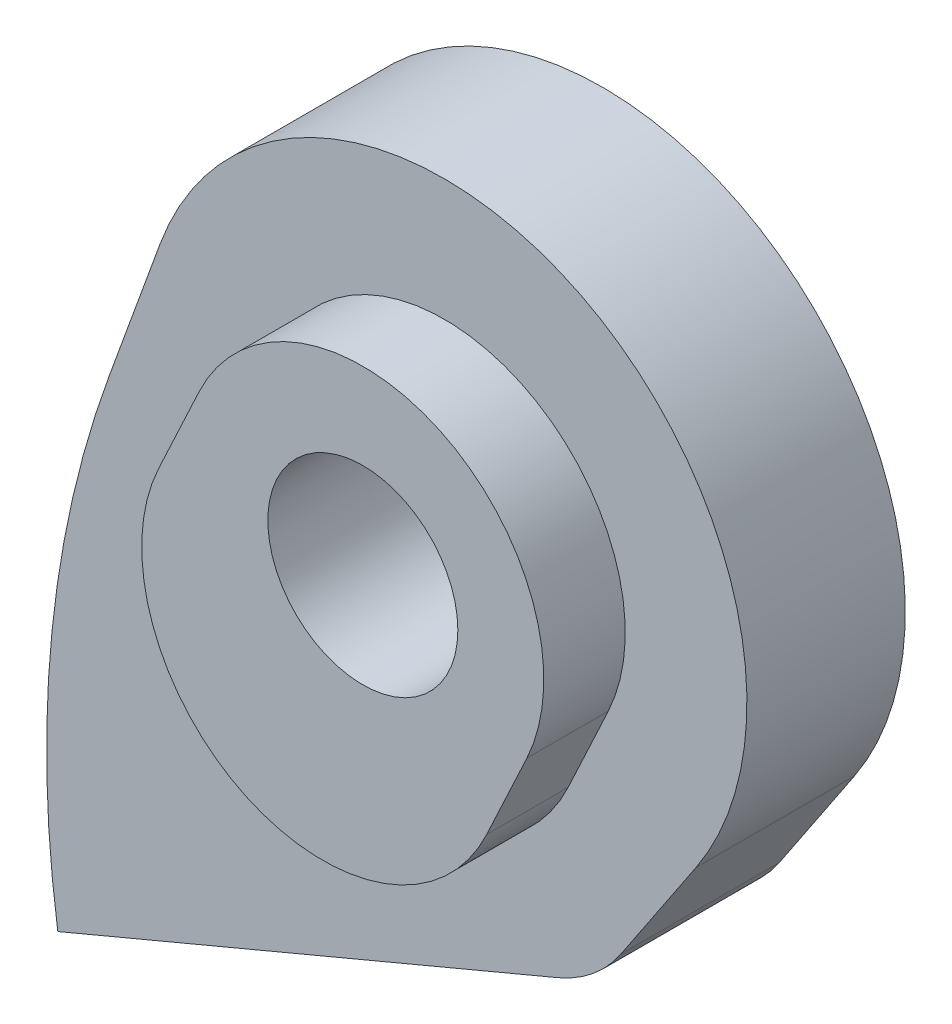
ISO-10303-21;
HEADER;
FILE_DESCRIPTION(('STEP AP214'),'2;1');
FILE_NAME('part.step','',(''),(''),'','','');
FILE_SCHEMA(('AUTOMOTIVE_DESIGN { 1 0 10303 214 1 1 1 1 }'));
ENDSEC;
DATA;
#1=APPLICATION_CONTEXT('core data for automotive mechanical design processes');
#2=APPLICATION_PROTOCOL_DEFINITION('international standard','automotive_design',2000,#1);
#3=PRODUCT_CONTEXT('',#1,'mechanical');
#4=PRODUCT('Part','Part','',(#3));
#5=PRODUCT_RELATED_PRODUCT_CATEGORY('part','',(#4));
#6=PRODUCT_DEFINITION_FORMATION('','',#4);
#7=PRODUCT_DEFINITION_CONTEXT('part definition',#1,'design');
#8=PRODUCT_DEFINITION('design','',#6,#7);
#9=PRODUCT_DEFINITION_SHAPE('','',#8);
#10=(LENGTH_UNIT() NAMED_UNIT(*) SI_UNIT(.MILLI.,.METRE.));
#11=(NAMED_UNIT(*) PLANE_ANGLE_UNIT() SI_UNIT($,.RADIAN.));
#12=(NAMED_UNIT(*) SI_UNIT($,.STERADIAN.) SOLID_ANGLE_UNIT());
#13=UNCERTAINTY_MEASURE_WITH_UNIT(LENGTH_MEASURE(1.E-05),#10,'distance_accuracy_value','');
#14=(GEOMETRIC_REPRESENTATION_CONTEXT(3) GLOBAL_UNCERTAINTY_ASSIGNED_CONTEXT((#13)) GLOBAL_UNIT_ASSIGNED_CONTEXT((#10,
#11,#12)) REPRESENTATION_CONTEXT('',''));
#15=CARTESIAN_POINT('',(0.,0.,0.));
#16=DIRECTION('',(0.,0.,1.));
#17=DIRECTION('',(1.,0.,0.));
#18=AXIS2_PLACEMENT_3D('',#15,#16,#17);
#19=CARTESIAN_POINT('',(0.11468761398859,80.1325343968941,0.));
#20=DIRECTION('',(0.,0.,1.));
#21=DIRECTION('',(1.,0.,0.));
#22=AXIS2_PLACEMENT_3D('',#19,#20,#21);
#23=PLANE('',#22);
#24=CARTESIAN_POINT('',(14.2795120747355,71.4970986035797,0.));
#25=DIRECTION('',(0.,0.,1.));
#26=DIRECTION('',(1.,0.,0.));
#27=AXIS2_PLACEMENT_3D('',#24,#25,#26);
#28=CIRCLE('',#27,22.9540740082007);
#29=CARTESIAN_POINT('',(-7.29026188774433,79.3478542857725,0.));
#30=VERTEX_POINT('',#29);
#31=CARTESIAN_POINT('',(-8.42769677737512,68.1396919078421,0.));
#32=VERTEX_POINT('',#31);
#33=EDGE_CURVE('E154',#30,#32,#28,.T.);
#34=ORIENTED_EDGE('',*,*,#33,.T.);
#35=DIRECTION('',(-0.921960246209325,-0.387284526426812,0.));
#36=VECTOR('',#35,1.);
#37=CARTESIAN_POINT('',(2.62584420432856,72.7829131335289,0.));
#38=LINE('',#37,#36);
#39=CARTESIAN_POINT('',(2.62584420432857,72.7829131335288,0.));
#40=VERTEX_POINT('',#39);
#41=EDGE_CURVE('E178',#40,#32,#38,.T.);
#42=ORIENTED_EDGE('',*,*,#41,.F.);
#43=CARTESIAN_POINT('',(1.41064938117233,75.6757767567832,0.));
#44=DIRECTION('',(0.,0.,-1.));
#45=DIRECTION('',(-1.,0.,0.));
#46=AXIS2_PLACEMENT_3D('',#43,#44,#45);
#47=CIRCLE('',#46,3.13773140994799);
#48=CARTESIAN_POINT('',(4.02035151590427,73.933705240183,0.));
#49=VERTEX_POINT('',#48);
#50=EDGE_CURVE('E173',#49,#40,#47,.T.);
#51=ORIENTED_EDGE('',*,*,#50,.F.);
#52=DIRECTION('',(0.555200968150768,0.831716228628761,0.));
#53=VECTOR('',#52,1.);
#54=CARTESIAN_POINT('',(4.02035151590429,73.933705240183,0.));
#55=LINE('',#54,#53);
#56=CARTESIAN_POINT('',(5.67886918351501,76.4182399199654,0.));
#57=VERTEX_POINT('',#56);
#58=EDGE_CURVE('E147',#49,#57,#55,.T.);
#59=ORIENTED_EDGE('',*,*,#58,.T.);
#60=CARTESIAN_POINT('',(0.11468761398859,80.1325343968941,0.));
#61=DIRECTION('',(0.,0.,1.));
#62=DIRECTION('',(1.,0.,0.));
#63=AXIS2_PLACEMENT_3D('',#60,#61,#62);
#64=CIRCLE('',#63,6.69000000000006);
#65=CARTESIAN_POINT('',(-6.17185601906935,82.4206491557424,0.));
#66=VERTEX_POINT('',#65);
#67=EDGE_CURVE('E149',#57,#66,#64,.T.);
#68=ORIENTED_EDGE('',*,*,#67,.T.);
#69=DIRECTION('',(-0.342020143325666,-0.939692620785909,0.));
#70=VECTOR('',#69,1.);
#71=CARTESIAN_POINT('',(-6.1718560190694,82.4206491557424,0.));
#72=LINE('',#71,#70);
#73=EDGE_CURVE('E155',#66,#30,#72,.T.);
#74=ORIENTED_EDGE('',*,*,#73,.T.);
#75=EDGE_LOOP('',(#34,#42,#51,#59,#68,#74));
#76=FACE_BOUND('',#75,.T.);
#77=DIRECTION('',(-0.4226182617407,-0.90630778703665,0.));
#78=VECTOR('',#77,1.);
#79=CARTESIAN_POINT('',(-3.51054353415801,81.8230074438569,0.));
#80=LINE('',#79,#78);
#81=CARTESIAN_POINT('',(-3.51054353415801,81.8230074438569,0.));
#82=VERTEX_POINT('',#81);
#83=CARTESIAN_POINT('',(-4.39804188381347,79.9197610910799,0.));
#84=VERTEX_POINT('',#83);
#85=EDGE_CURVE('E241',#82,#84,#80,.T.);
#86=ORIENTED_EDGE('',*,*,#85,.F.);
#87=CARTESIAN_POINT('',(0.114687613988609,80.1325343968941,0.));
#88=DIRECTION('',(0.,0.,1.));
#89=DIRECTION('',(1.,0.,0.));
#90=AXIS2_PLACEMENT_3D('',#87,#88,#89);
#91=CIRCLE('',#90,4.00000000000001);
#92=CARTESIAN_POINT('',(3.73991876213519,78.4420613499313,0.));
#93=VERTEX_POINT('',#92);
#94=EDGE_CURVE('E145',#93,#82,#91,.T.);
#95=ORIENTED_EDGE('',*,*,#94,.F.);
#96=DIRECTION('',(0.4226182617407,0.90630778703665,0.));
#97=VECTOR('',#96,1.);
#98=CARTESIAN_POINT('',(3.73991876213519,78.4420613499313,0.));
#99=LINE('',#98,#97);
#100=CARTESIAN_POINT('',(2.85242041247973,76.5388149971543,0.));
#101=VERTEX_POINT('',#100);
#102=EDGE_CURVE('E141',#101,#93,#99,.T.);
#103=ORIENTED_EDGE('',*,*,#102,.F.);
#104=CARTESIAN_POINT('',(-0.772810735666862,78.2292880441171,0.));
#105=DIRECTION('',(0.,0.,1.));
#106=DIRECTION('',(1.,0.,0.));
#107=AXIS2_PLACEMENT_3D('',#104,#105,#106);
#108=CIRCLE('',#107,4.00000000000001);
#109=EDGE_CURVE('E243',#84,#101,#108,.T.);
#110=ORIENTED_EDGE('',*,*,#109,.F.);
#111=EDGE_LOOP('',(#86,#95,#103,#110));
#112=FACE_BOUND('',#111,.T.);
#113=ADVANCED_FACE('F33',(#76,#112),#23,.T.);
#114=CARTESIAN_POINT('',(-8.01359795678153,76.9658058271043,-6.5));
#115=DIRECTION('',(-0.921960246209324,-0.387284526426815,0.));
#116=DIRECTION('',(0.387284526426815,-0.921960246209324,0.));
#117=AXIS2_PLACEMENT_3D('',#114,#115,#116);
#118=PLANE('',#117);
#119=DIRECTION('',(0.387284526426815,-0.921960246209324,0.));
#120=VECTOR('',#119,1.);
#121=CARTESIAN_POINT('',(-8.01359795678153,76.9658058271043,-3.5));
#122=LINE('',#121,#120);
#123=CARTESIAN_POINT('',(-8.01359795678153,76.9658058271043,-3.5));
#124=VERTEX_POINT('',#123);
#125=CARTESIAN_POINT('',(-4.92424784177968,69.611373108264,-3.5));
#126=VERTEX_POINT('',#125);
#127=EDGE_CURVE('E56',#124,#126,#122,.T.);
#128=ORIENTED_EDGE('',*,*,#127,.T.);
#129=DIRECTION('',(0.,0.,1.));
#130=VECTOR('',#129,1.);
#131=CARTESIAN_POINT('',(-4.92424784177968,69.611373108264,-6.5));
#132=LINE('',#131,#130);
#133=CARTESIAN_POINT('',(-4.92424784177968,69.611373108264,-6.5));
#134=VERTEX_POINT('',#133);
#135=EDGE_CURVE('E166',#134,#126,#132,.T.);
#136=ORIENTED_EDGE('',*,*,#135,.F.);
#137=DIRECTION('',(0.387284526426815,-0.921960246209324,0.));
#138=VECTOR('',#137,1.);
#139=CARTESIAN_POINT('',(-8.01359795678153,76.9658058271043,-6.5));
#140=LINE('',#139,#138);
#141=CARTESIAN_POINT('',(-8.01359795678153,76.9658058271043,-6.5));
#142=VERTEX_POINT('',#141);
#143=EDGE_CURVE('E164',#142,#134,#140,.T.);
#144=ORIENTED_EDGE('',*,*,#143,.F.);
#145=DIRECTION('',(0.,0.,1.));
#146=VECTOR('',#145,1.);
#147=CARTESIAN_POINT('',(-8.01359795678153,76.9658058271043,-6.5));
#148=LINE('',#147,#146);
#149=EDGE_CURVE('E170',#142,#124,#148,.T.);
#150=ORIENTED_EDGE('',*,*,#149,.T.);
#151=EDGE_LOOP('',(#128,#136,#144,#150));
#152=FACE_BOUND('',#151,.T.);
#153=ADVANCED_FACE('F230',(#152),#118,.F.);
#154=CARTESIAN_POINT('',(14.2795120747355,71.4970986035797,-6.5));
#155=DIRECTION('',(0.,0.,1.));
#156=DIRECTION('',(1.,0.,0.));
#157=AXIS2_PLACEMENT_3D('',#154,#155,#156);
#158=PLANE('',#157);
#159=DIRECTION('',(-0.921960246209326,-0.38728452642681,0.));
#160=VECTOR('',#159,1.);
#161=CARTESIAN_POINT('',(-4.92424784177968,69.611373108264,-6.5));
#162=LINE('',#161,#160);
#163=CARTESIAN_POINT('',(-8.42769677737511,68.1396919078421,-6.5));
#164=VERTEX_POINT('',#163);
#165=EDGE_CURVE('E159',#134,#164,#162,.T.);
#166=ORIENTED_EDGE('',*,*,#165,.T.);
#167=CARTESIAN_POINT('',(14.2795120747355,71.4970986035797,-6.5));
#168=DIRECTION('',(0.,0.,-1.));
#169=DIRECTION('',(1.,0.,0.));
#170=AXIS2_PLACEMENT_3D('',#167,#168,#169);
#171=CIRCLE('',#170,22.9540740082007);
#172=EDGE_CURVE('E162',#164,#142,#171,.T.);
#173=ORIENTED_EDGE('',*,*,#172,.T.);
#174=ORIENTED_EDGE('',*,*,#143,.T.);
#175=EDGE_LOOP('',(#166,#173,#174));
#176=FACE_BOUND('',#175,.T.);
#177=ADVANCED_FACE('F281',(#176),#158,.F.);
#178=CARTESIAN_POINT('',(0.11468761398859,80.1325343968941,-3.5));
#179=DIRECTION('',(0.,0.,1.));
#180=DIRECTION('',(1.,0.,0.));
#181=AXIS2_PLACEMENT_3D('',#178,#179,#180);
#182=PLANE('',#181);
#183=CARTESIAN_POINT('',(0.11468761398859,80.1325343968941,-3.5));
#184=DIRECTION('',(0.,0.,1.));
#185=DIRECTION('',(1.,0.,0.));
#186=AXIS2_PLACEMENT_3D('',#183,#184,#185);
#187=CIRCLE('',#186,2.10000000000001);
#188=CARTESIAN_POINT('',(2.2146876139886,80.1325343968941,-3.5));
#189=VERTEX_POINT('',#188);
#190=EDGE_CURVE('E246',#189,#189,#187,.T.);
#191=ORIENTED_EDGE('',*,*,#190,.T.);
#192=EDGE_LOOP('',(#191));
#193=FACE_BOUND('',#192,.T.);
#194=ORIENTED_EDGE('',*,*,#127,.F.);
#195=CARTESIAN_POINT('',(14.2795120747355,71.4970986035797,-3.5));
#196=DIRECTION('',(0.,0.,-1.));
#197=DIRECTION('',(-1.,0.,0.));
#198=AXIS2_PLACEMENT_3D('',#195,#196,#197);
#199=CIRCLE('',#198,22.9540740082007);
#200=CARTESIAN_POINT('',(-7.29026188774433,79.3478542857725,-3.5));
#201=VERTEX_POINT('',#200);
#202=EDGE_CURVE('E184',#124,#201,#199,.T.);
#203=ORIENTED_EDGE('',*,*,#202,.T.);
#204=DIRECTION('',(0.342020143325687,0.939692620785902,0.));
#205=VECTOR('',#204,1.);
#206=CARTESIAN_POINT('',(-6.17185601906934,82.4206491557424,-3.5));
#207=LINE('',#206,#205);
#208=CARTESIAN_POINT('',(-6.17185601906934,82.4206491557424,-3.5));
#209=VERTEX_POINT('',#208);
#210=EDGE_CURVE('E186',#201,#209,#207,.T.);
#211=ORIENTED_EDGE('',*,*,#210,.T.);
#212=CARTESIAN_POINT('',(0.11468761398859,80.1325343968941,-3.5));
#213=DIRECTION('',(0.,0.,-1.));
#214=DIRECTION('',(1.,0.,0.));
#215=AXIS2_PLACEMENT_3D('',#212,#213,#214);
#216=CIRCLE('',#215,6.69000000000002);
#217=CARTESIAN_POINT('',(5.67886918351501,76.4182399199654,-3.5));
#218=VERTEX_POINT('',#217);
#219=EDGE_CURVE('E174',#209,#218,#216,.T.);
#220=ORIENTED_EDGE('',*,*,#219,.T.);
#221=DIRECTION('',(-0.555200968150769,-0.83171622862876,0.));
#222=VECTOR('',#221,1.);
#223=CARTESIAN_POINT('',(5.67886918351501,76.4182399199654,-3.5));
#224=LINE('',#223,#222);
#225=CARTESIAN_POINT('',(4.02035151590429,73.933705240183,-3.5));
#226=VERTEX_POINT('',#225);
#227=EDGE_CURVE('E177',#218,#226,#224,.T.);
#228=ORIENTED_EDGE('',*,*,#227,.T.);
#229=CARTESIAN_POINT('',(1.41064938117233,75.6757767567832,-3.5));
#230=DIRECTION('',(0.,0.,-1.));
#231=DIRECTION('',(-1.,0.,0.));
#232=AXIS2_PLACEMENT_3D('',#229,#230,#231);
#233=CIRCLE('',#232,3.13773140994799);
#234=CARTESIAN_POINT('',(2.62584420432857,72.7829131335288,-3.5));
#235=VERTEX_POINT('',#234);
#236=EDGE_CURVE('E180',#226,#235,#233,.T.);
#237=ORIENTED_EDGE('',*,*,#236,.T.);
#238=DIRECTION('',(-0.921960246209325,-0.387284526426812,0.));
#239=VECTOR('',#238,1.);
#240=CARTESIAN_POINT('',(2.62584420432856,72.7829131335289,-3.5));
#241=LINE('',#240,#239);
#242=EDGE_CURVE('E182',#235,#126,#241,.T.);
#243=ORIENTED_EDGE('',*,*,#242,.T.);
#244=EDGE_LOOP('',(#194,#203,#211,#220,#228,#237,#243));
#245=FACE_BOUND('',#244,.T.);
#246=ADVANCED_FACE('F212',(#193,#245),#182,.F.);
#247=CARTESIAN_POINT('',(1.41064938117233,75.6757767567832,-3.5));
#248=DIRECTION('',(0.,0.,1.));
#249=DIRECTION('',(1.,0.,0.));
#250=AXIS2_PLACEMENT_3D('',#247,#248,#249);
#251=CYLINDRICAL_SURFACE('',#250,3.13773140994799);
#252=ORIENTED_EDGE('',*,*,#50,.T.);
#253=DIRECTION('',(0.,0.,1.));
#254=VECTOR('',#253,1.);
#255=CARTESIAN_POINT('',(2.62584420432857,72.7829131335288,-3.5));
#256=LINE('',#255,#254);
#257=EDGE_CURVE('E196',#235,#40,#256,.T.);
#258=ORIENTED_EDGE('',*,*,#257,.F.);
#259=ORIENTED_EDGE('',*,*,#236,.F.);
#260=DIRECTION('',(0.,0.,1.));
#261=VECTOR('',#260,1.);
#262=CARTESIAN_POINT('',(4.02035151590429,73.933705240183,-3.5));
#263=LINE('',#262,#261);
#264=EDGE_CURVE('E199',#226,#49,#263,.T.);
#265=ORIENTED_EDGE('',*,*,#264,.T.);
#266=EDGE_LOOP('',(#252,#258,#259,#265));
#267=FACE_BOUND('',#266,.T.);
#268=ADVANCED_FACE('F223',(#267),#251,.T.);
#269=CARTESIAN_POINT('',(2.62584420432856,72.7829131335289,-3.5));
#270=DIRECTION('',(-0.387284526426812,0.921960246209325,0.));
#271=DIRECTION('',(-0.921960246209325,-0.387284526426812,0.));
#272=AXIS2_PLACEMENT_3D('',#269,#270,#271);
#273=PLANE('',#272);
#274=ORIENTED_EDGE('',*,*,#41,.T.);
#275=DIRECTION('',(0.,0.,1.));
#276=VECTOR('',#275,1.);
#277=CARTESIAN_POINT('',(-8.42769677737511,68.1396919078421,-3.5));
#278=LINE('',#277,#276);
#279=EDGE_CURVE('E189',#164,#32,#278,.T.);
#280=ORIENTED_EDGE('',*,*,#279,.F.);
#281=ORIENTED_EDGE('',*,*,#165,.F.);
#282=ORIENTED_EDGE('',*,*,#135,.T.);
#283=ORIENTED_EDGE('',*,*,#242,.F.);
#284=ORIENTED_EDGE('',*,*,#257,.T.);
#285=EDGE_LOOP('',(#274,#280,#281,#282,#283,#284));
#286=FACE_BOUND('',#285,.T.);
#287=ADVANCED_FACE('F225',(#286),#273,.F.);
#288=CARTESIAN_POINT('',(14.2795120747355,71.4970986035797,11.));
#289=DIRECTION('',(0.,0.,-1.));
#290=DIRECTION('',(-1.,0.,0.));
#291=AXIS2_PLACEMENT_3D('',#288,#289,#290);
#292=CYLINDRICAL_SURFACE('',#291,22.9540740082007);
#293=ORIENTED_EDGE('',*,*,#33,.F.);
#294=DIRECTION('',(0.,0.,-1.));
#295=VECTOR('',#294,1.);
#296=CARTESIAN_POINT('',(-7.29026188774433,79.3478542857725,11.));
#297=LINE('',#296,#295);
#298=EDGE_CURVE('E202',#30,#201,#297,.T.);
#299=ORIENTED_EDGE('',*,*,#298,.T.);
#300=ORIENTED_EDGE('',*,*,#202,.F.);
#301=ORIENTED_EDGE('',*,*,#149,.F.);
#302=ORIENTED_EDGE('',*,*,#172,.F.);
#303=ORIENTED_EDGE('',*,*,#279,.T.);
#304=EDGE_LOOP('',(#293,#299,#300,#301,#302,#303));
#305=FACE_BOUND('',#304,.T.);
#306=ADVANCED_FACE('F235',(#305),#292,.T.);
#307=CARTESIAN_POINT('',(-6.1718560190694,82.4206491557424,11.));
#308=DIRECTION('',(0.939692620785909,-0.342020143325666,0.));
#309=DIRECTION('',(0.342020143325666,0.939692620785909,0.));
#310=AXIS2_PLACEMENT_3D('',#307,#308,#309);
#311=PLANE('',#310);
#312=ORIENTED_EDGE('',*,*,#73,.F.);
#313=DIRECTION('',(0.,0.,-1.));
#314=VECTOR('',#313,1.);
#315=CARTESIAN_POINT('',(-6.17185601906935,82.4206491557424,11.));
#316=LINE('',#315,#314);
#317=EDGE_CURVE('E41',#66,#209,#316,.T.);
#318=ORIENTED_EDGE('',*,*,#317,.T.);
#319=ORIENTED_EDGE('',*,*,#210,.F.);
#320=ORIENTED_EDGE('',*,*,#298,.F.);
#321=EDGE_LOOP('',(#312,#318,#319,#320));
#322=FACE_BOUND('',#321,.T.);
#323=ADVANCED_FACE('F207',(#322),#311,.F.);
#324=CARTESIAN_POINT('',(0.11468761398859,80.1325343968941,11.));
#325=DIRECTION('',(0.,0.,-1.));
#326=DIRECTION('',(-1.,0.,0.));
#327=AXIS2_PLACEMENT_3D('',#324,#325,#326);
#328=CYLINDRICAL_SURFACE('',#327,6.69000000000006);
#329=ORIENTED_EDGE('',*,*,#317,.F.);
#330=ORIENTED_EDGE('',*,*,#67,.F.);
#331=DIRECTION('',(0.,0.,-1.));
#332=VECTOR('',#331,1.);
#333=CARTESIAN_POINT('',(5.67886918351501,76.4182399199654,11.));
#334=LINE('',#333,#332);
#335=EDGE_CURVE('E11',#57,#218,#334,.T.);
#336=ORIENTED_EDGE('',*,*,#335,.T.);
#337=ORIENTED_EDGE('',*,*,#219,.F.);
#338=EDGE_LOOP('',(#329,#330,#336,#337));
#339=FACE_BOUND('',#338,.T.);
#340=ADVANCED_FACE('F213',(#339),#328,.T.);
#341=CARTESIAN_POINT('',(4.02035151590429,73.933705240183,11.));
#342=DIRECTION('',(-0.831716228628761,0.555200968150768,0.));
#343=DIRECTION('',(-0.555200968150768,-0.831716228628761,0.));
#344=AXIS2_PLACEMENT_3D('',#341,#342,#343);
#345=PLANE('',#344);
#346=ORIENTED_EDGE('',*,*,#58,.F.);
#347=ORIENTED_EDGE('',*,*,#264,.F.);
#348=ORIENTED_EDGE('',*,*,#227,.F.);
#349=ORIENTED_EDGE('',*,*,#335,.F.);
#350=EDGE_LOOP('',(#346,#347,#348,#349));
#351=FACE_BOUND('',#350,.T.);
#352=ADVANCED_FACE('F35',(#351),#345,.F.);
#353=CARTESIAN_POINT('',(0.114687613988609,80.1325343968941,1.8));
#354=DIRECTION('',(0.,0.,-1.));
#355=DIRECTION('',(-1.,0.,0.));
#356=AXIS2_PLACEMENT_3D('',#353,#354,#355);
#357=CYLINDRICAL_SURFACE('',#356,4.00000000000001);
#358=ORIENTED_EDGE('',*,*,#94,.T.);
#359=DIRECTION('',(0.,0.,-1.));
#360=VECTOR('',#359,1.);
#361=CARTESIAN_POINT('',(-3.51054353415801,81.8230074438569,1.8));
#362=LINE('',#361,#360);
#363=CARTESIAN_POINT('',(-3.51054353415801,81.8230074438569,1.8));
#364=VERTEX_POINT('',#363);
#365=EDGE_CURVE('E126',#364,#82,#362,.T.);
#366=ORIENTED_EDGE('',*,*,#365,.F.);
#367=CARTESIAN_POINT('',(0.114687613988609,80.1325343968941,1.8));
#368=DIRECTION('',(0.,0.,1.));
#369=DIRECTION('',(1.,0.,0.));
#370=AXIS2_PLACEMENT_3D('',#367,#368,#369);
#371=CIRCLE('',#370,4.00000000000001);
#372=CARTESIAN_POINT('',(3.73991876213519,78.4420613499313,1.8));
#373=VERTEX_POINT('',#372);
#374=EDGE_CURVE('E133',#373,#364,#371,.T.);
#375=ORIENTED_EDGE('',*,*,#374,.F.);
#376=DIRECTION('',(0.,0.,-1.));
#377=VECTOR('',#376,1.);
#378=CARTESIAN_POINT('',(3.73991876213519,78.4420613499313,1.8));
#379=LINE('',#378,#377);
#380=EDGE_CURVE('E251',#373,#93,#379,.T.);
#381=ORIENTED_EDGE('',*,*,#380,.T.);
#382=EDGE_LOOP('',(#358,#366,#375,#381));
#383=FACE_BOUND('',#382,.T.);
#384=ADVANCED_FACE('F143',(#383),#357,.T.);
#385=CARTESIAN_POINT('',(-3.51054353415801,81.8230074438569,1.8));
#386=DIRECTION('',(0.90630778703665,-0.4226182617407,0.));
#387=DIRECTION('',(0.4226182617407,0.90630778703665,0.));
#388=AXIS2_PLACEMENT_3D('',#385,#386,#387);
#389=PLANE('',#388);
#390=ORIENTED_EDGE('',*,*,#85,.T.);
#391=DIRECTION('',(0.,0.,-1.));
#392=VECTOR('',#391,1.);
#393=CARTESIAN_POINT('',(-4.39804188381347,79.9197610910799,1.8));
#394=LINE('',#393,#392);
#395=CARTESIAN_POINT('',(-4.39804188381347,79.9197610910799,1.8));
#396=VERTEX_POINT('',#395);
#397=EDGE_CURVE('E129',#396,#84,#394,.T.);
#398=ORIENTED_EDGE('',*,*,#397,.F.);
#399=DIRECTION('',(-0.4226182617407,-0.90630778703665,0.));
#400=VECTOR('',#399,1.);
#401=CARTESIAN_POINT('',(-3.51054353415801,81.8230074438569,1.8));
#402=LINE('',#401,#400);
#403=EDGE_CURVE('E122',#364,#396,#402,.T.);
#404=ORIENTED_EDGE('',*,*,#403,.F.);
#405=ORIENTED_EDGE('',*,*,#365,.T.);
#406=EDGE_LOOP('',(#390,#398,#404,#405));
#407=FACE_BOUND('',#406,.T.);
#408=ADVANCED_FACE('F124',(#407),#389,.F.);
#409=CARTESIAN_POINT('',(-0.772810735666862,78.2292880441171,1.8));
#410=DIRECTION('',(0.,0.,-1.));
#411=DIRECTION('',(-1.,0.,0.));
#412=AXIS2_PLACEMENT_3D('',#409,#410,#411);
#413=CYLINDRICAL_SURFACE('',#412,4.00000000000001);
#414=ORIENTED_EDGE('',*,*,#109,.T.);
#415=DIRECTION('',(0.,0.,-1.));
#416=VECTOR('',#415,1.);
#417=CARTESIAN_POINT('',(2.85242041247973,76.5388149971543,1.8));
#418=LINE('',#417,#416);
#419=CARTESIAN_POINT('',(2.85242041247973,76.5388149971543,1.8));
#420=VERTEX_POINT('',#419);
#421=EDGE_CURVE('E48',#420,#101,#418,.T.);
#422=ORIENTED_EDGE('',*,*,#421,.F.);
#423=CARTESIAN_POINT('',(-0.772810735666862,78.2292880441171,1.8));
#424=DIRECTION('',(0.,0.,1.));
#425=DIRECTION('',(1.,0.,0.));
#426=AXIS2_PLACEMENT_3D('',#423,#424,#425);
#427=CIRCLE('',#426,4.00000000000001);
#428=EDGE_CURVE('E132',#396,#420,#427,.T.);
#429=ORIENTED_EDGE('',*,*,#428,.F.);
#430=ORIENTED_EDGE('',*,*,#397,.T.);
#431=EDGE_LOOP('',(#414,#422,#429,#430));
#432=FACE_BOUND('',#431,.T.);
#433=ADVANCED_FACE('F271',(#432),#413,.T.);
#434=CARTESIAN_POINT('',(3.73991876213519,78.4420613499313,1.8));
#435=DIRECTION('',(-0.90630778703665,0.4226182617407,0.));
#436=DIRECTION('',(-0.4226182617407,-0.90630778703665,0.));
#437=AXIS2_PLACEMENT_3D('',#434,#435,#436);
#438=PLANE('',#437);
#439=ORIENTED_EDGE('',*,*,#102,.T.);
#440=ORIENTED_EDGE('',*,*,#380,.F.);
#441=DIRECTION('',(0.4226182617407,0.90630778703665,0.));
#442=VECTOR('',#441,1.);
#443=CARTESIAN_POINT('',(3.73991876213519,78.4420613499313,1.8));
#444=LINE('',#443,#442);
#445=EDGE_CURVE('E137',#420,#373,#444,.T.);
#446=ORIENTED_EDGE('',*,*,#445,.F.);
#447=ORIENTED_EDGE('',*,*,#421,.T.);
#448=EDGE_LOOP('',(#439,#440,#446,#447));
#449=FACE_BOUND('',#448,.T.);
#450=ADVANCED_FACE('F264',(#449),#438,.F.);
#451=CARTESIAN_POINT('',(0.114687613988609,80.1325343968941,1.8));
#452=DIRECTION('',(0.,0.,1.));
#453=DIRECTION('',(1.,0.,0.));
#454=AXIS2_PLACEMENT_3D('',#451,#452,#453);
#455=PLANE('',#454);
#456=CARTESIAN_POINT('',(0.11468761398859,80.1325343968941,1.8));
#457=DIRECTION('',(0.,0.,1.));
#458=DIRECTION('',(1.,0.,0.));
#459=AXIS2_PLACEMENT_3D('',#456,#457,#458);
#460=CIRCLE('',#459,2.10000000000001);
#461=CARTESIAN_POINT('',(2.2146876139886,80.1325343968941,1.8));
#462=VERTEX_POINT('',#461);
#463=EDGE_CURVE('E256',#462,#462,#460,.T.);
#464=ORIENTED_EDGE('',*,*,#463,.F.);
#465=EDGE_LOOP('',(#464));
#466=FACE_BOUND('',#465,.T.);
#467=ORIENTED_EDGE('',*,*,#374,.T.);
#468=ORIENTED_EDGE('',*,*,#403,.T.);
#469=ORIENTED_EDGE('',*,*,#428,.T.);
#470=ORIENTED_EDGE('',*,*,#445,.T.);
#471=EDGE_LOOP('',(#467,#468,#469,#470));
#472=FACE_BOUND('',#471,.T.);
#473=ADVANCED_FACE('F136',(#466,#472),#455,.T.);
#474=CARTESIAN_POINT('',(0.11468761398859,80.1325343968941,-6.5));
#475=DIRECTION('',(0.,0.,1.));
#476=DIRECTION('',(1.,0.,0.));
#477=AXIS2_PLACEMENT_3D('',#474,#475,#476);
#478=CYLINDRICAL_SURFACE('',#477,2.10000000000001);
#479=CARTESIAN_POINT('',(2.2146876139886,80.1325343968941,1.8));
#480=CARTESIAN_POINT('',(2.2146876139886,80.1325343968941,1.74479166666667));
#481=CARTESIAN_POINT('',(2.2146876139886,80.1325343968941,1.68958333333333));
#482=CARTESIAN_POINT('',(2.2146876139886,80.1325343968941,1.57916666666667));
#483=CARTESIAN_POINT('',(2.2146876139886,80.1325343968941,1.52395833333333));
#484=CARTESIAN_POINT('',(2.2146876139886,80.1325343968941,1.41354166666667));
#485=CARTESIAN_POINT('',(2.2146876139886,80.1325343968941,1.35833333333333));
#486=CARTESIAN_POINT('',(2.2146876139886,80.1325343968941,1.24791666666667));
#487=CARTESIAN_POINT('',(2.2146876139886,80.1325343968941,1.19270833333333));
#488=CARTESIAN_POINT('',(2.2146876139886,80.1325343968941,1.08229166666667));
#489=CARTESIAN_POINT('',(2.2146876139886,80.1325343968941,1.02708333333333));
#490=CARTESIAN_POINT('',(2.2146876139886,80.1325343968941,0.916666666666667));
#491=CARTESIAN_POINT('',(2.2146876139886,80.1325343968941,0.861458333333334));
#492=CARTESIAN_POINT('',(2.2146876139886,80.1325343968941,0.751041666666667));
#493=CARTESIAN_POINT('',(2.2146876139886,80.1325343968941,0.695833333333333));
#494=CARTESIAN_POINT('',(2.2146876139886,80.1325343968941,0.585416666666667));
#495=CARTESIAN_POINT('',(2.2146876139886,80.1325343968941,0.530208333333334));
#496=CARTESIAN_POINT('',(2.2146876139886,80.1325343968941,0.419791666666667));
#497=CARTESIAN_POINT('',(2.2146876139886,80.1325343968941,0.364583333333333));
#498=CARTESIAN_POINT('',(2.2146876139886,80.1325343968941,0.254166666666667));
#499=CARTESIAN_POINT('',(2.2146876139886,80.1325343968941,0.198958333333334));
#500=CARTESIAN_POINT('',(2.2146876139886,80.1325343968941,0.088541666666667));
#501=CARTESIAN_POINT('',(2.2146876139886,80.1325343968941,0.0333333333333334));
#502=CARTESIAN_POINT('',(2.2146876139886,80.1325343968941,-0.0770833333333335));
#503=CARTESIAN_POINT('',(2.2146876139886,80.1325343968941,-0.132291666666667));
#504=CARTESIAN_POINT('',(2.2146876139886,80.1325343968941,-0.242708333333333));
#505=CARTESIAN_POINT('',(2.2146876139886,80.1325343968941,-0.297916666666667));
#506=CARTESIAN_POINT('',(2.2146876139886,80.1325343968941,-0.408333333333333));
#507=CARTESIAN_POINT('',(2.2146876139886,80.1325343968941,-0.463541666666667));
#508=CARTESIAN_POINT('',(2.2146876139886,80.1325343968941,-0.573958333333333));
#509=CARTESIAN_POINT('',(2.2146876139886,80.1325343968941,-0.629166666666667));
#510=CARTESIAN_POINT('',(2.2146876139886,80.1325343968941,-0.739583333333333));
#511=CARTESIAN_POINT('',(2.2146876139886,80.1325343968941,-0.794791666666667));
#512=CARTESIAN_POINT('',(2.2146876139886,80.1325343968941,-0.905208333333333));
#513=CARTESIAN_POINT('',(2.2146876139886,80.1325343968941,-0.960416666666667));
#514=CARTESIAN_POINT('',(2.2146876139886,80.1325343968941,-1.07083333333333));
#515=CARTESIAN_POINT('',(2.2146876139886,80.1325343968941,-1.12604166666667));
#516=CARTESIAN_POINT('',(2.2146876139886,80.1325343968941,-1.23645833333333));
#517=CARTESIAN_POINT('',(2.2146876139886,80.1325343968941,-1.29166666666667));
#518=CARTESIAN_POINT('',(2.2146876139886,80.1325343968941,-1.40208333333333));
#519=CARTESIAN_POINT('',(2.2146876139886,80.1325343968941,-1.45729166666667));
#520=CARTESIAN_POINT('',(2.2146876139886,80.1325343968941,-1.56770833333333));
#521=CARTESIAN_POINT('',(2.2146876139886,80.1325343968941,-1.62291666666667));
#522=CARTESIAN_POINT('',(2.2146876139886,80.1325343968941,-1.73333333333333));
#523=CARTESIAN_POINT('',(2.2146876139886,80.1325343968941,-1.78854166666667));
#524=CARTESIAN_POINT('',(2.2146876139886,80.1325343968941,-1.89895833333333));
#525=CARTESIAN_POINT('',(2.2146876139886,80.1325343968941,-1.95416666666667));
#526=CARTESIAN_POINT('',(2.2146876139886,80.1325343968941,-2.06458333333333));
#527=CARTESIAN_POINT('',(2.2146876139886,80.1325343968941,-2.11979166666667));
#528=CARTESIAN_POINT('',(2.2146876139886,80.1325343968941,-2.23020833333333));
#529=CARTESIAN_POINT('',(2.2146876139886,80.1325343968941,-2.28541666666667));
#530=CARTESIAN_POINT('',(2.2146876139886,80.1325343968941,-2.39583333333333));
#531=CARTESIAN_POINT('',(2.2146876139886,80.1325343968941,-2.45104166666667));
#532=CARTESIAN_POINT('',(2.2146876139886,80.1325343968941,-2.56145833333333));
#533=CARTESIAN_POINT('',(2.2146876139886,80.1325343968941,-2.61666666666667));
#534=CARTESIAN_POINT('',(2.2146876139886,80.1325343968941,-2.72708333333333));
#535=CARTESIAN_POINT('',(2.2146876139886,80.1325343968941,-2.78229166666667));
#536=CARTESIAN_POINT('',(2.2146876139886,80.1325343968941,-2.89270833333333));
#537=CARTESIAN_POINT('',(2.2146876139886,80.1325343968941,-2.94791666666667));
#538=CARTESIAN_POINT('',(2.2146876139886,80.1325343968941,-3.05833333333333));
#539=CARTESIAN_POINT('',(2.2146876139886,80.1325343968941,-3.11354166666667));
#540=CARTESIAN_POINT('',(2.2146876139886,80.1325343968941,-3.22395833333333));
#541=CARTESIAN_POINT('',(2.2146876139886,80.1325343968941,-3.27916666666667));
#542=CARTESIAN_POINT('',(2.2146876139886,80.1325343968941,-3.38958333333333));
#543=CARTESIAN_POINT('',(2.2146876139886,80.1325343968941,-3.44479166666667));
#544=CARTESIAN_POINT('',(2.2146876139886,80.1325343968941,-3.5));
#545=B_SPLINE_CURVE_WITH_KNOTS('',3,(#479,#480,#481,#482,#483,#484,#485,#486,#487,#488,#489,
#490,#491,#492,#493,#494,#495,#496,#497,#498,#499,#500,#501,#502,#503,#504,#505,#506,#507,#508,
#509,#510,#511,#512,#513,#514,#515,#516,#517,#518,#519,#520,#521,#522,#523,#524,#525,#526,#527,
#528,#529,#530,#531,#532,#533,#534,#535,#536,#537,#538,#539,#540,#541,#542,#543,#544),
.UNSPECIFIED.,.F.,.F.,(4,2,2,2,2,2,2,2,2,2,2,2,2,2,2,2,2,2,2,2,2,2,2,2,2,2,2,2,2,2,2,2,4),(0.,
0.165625000000001,0.33125,0.496874999999999,0.662499999999999,0.828124999999999,
0.993749999999999,1.159375,1.325,1.490625,1.65625,1.821875,1.9875,2.153125,2.31875,2.484375,
2.65,2.815625,2.98125,3.146875,3.3125,3.478125,3.64375,3.809375,3.975,4.140625,4.30625,4.471875,
4.6375,4.803125,4.96875,5.134375,5.3),.UNSPECIFIED.);
#546=EDGE_CURVE('BSEAM260',#462,#189,#545,.T.);
#547=ORIENTED_EDGE('',*,*,#463,.T.);
#548=ORIENTED_EDGE('',*,*,#190,.F.);
#549=ORIENTED_EDGE('',*,*,#546,.T.);
#550=ORIENTED_EDGE('',*,*,#546,.F.);
#551=EDGE_LOOP('',(#547,#549,#548,#550));
#552=FACE_BOUND('',#551,.T.);
#553=ADVANCED_FACE('F260',(#552),#478,.F.);
#554=CLOSED_SHELL('',(#113,#153,#177,#246,#268,#287,#306,#323,#340,#352,#384,#408,#433,#450,
#473,#553));
#555=MANIFOLD_SOLID_BREP('B2',#554);
#556=ADVANCED_BREP_SHAPE_REPRESENTATION('',(#18,#555),#14);
#557=SHAPE_DEFINITION_REPRESENTATION(#9,#556);
ENDSEC;
END-ISO-10303-21;
